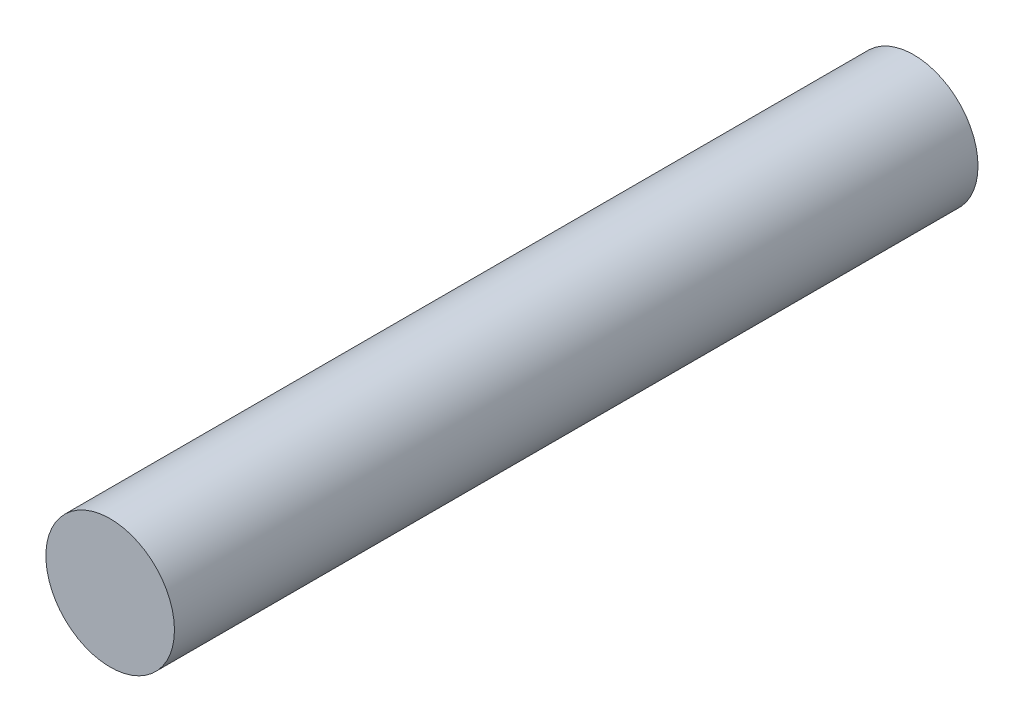
ISO-10303-21;
HEADER;
FILE_DESCRIPTION(('STEP AP214'),'2;1');
FILE_NAME('part.step','',(''),(''),'','','');
FILE_SCHEMA(('AUTOMOTIVE_DESIGN { 1 0 10303 214 1 1 1 1 }'));
ENDSEC;
DATA;
#1=APPLICATION_CONTEXT('core data for automotive mechanical design processes');
#2=APPLICATION_PROTOCOL_DEFINITION('international standard','automotive_design',2000,#1);
#3=PRODUCT_CONTEXT('',#1,'mechanical');
#4=PRODUCT('Part','Part','',(#3));
#5=PRODUCT_RELATED_PRODUCT_CATEGORY('part','',(#4));
#6=PRODUCT_DEFINITION_FORMATION('','',#4);
#7=PRODUCT_DEFINITION_CONTEXT('part definition',#1,'design');
#8=PRODUCT_DEFINITION('design','',#6,#7);
#9=PRODUCT_DEFINITION_SHAPE('','',#8);
#10=(LENGTH_UNIT() NAMED_UNIT(*) SI_UNIT(.MILLI.,.METRE.));
#11=(NAMED_UNIT(*) PLANE_ANGLE_UNIT() SI_UNIT($,.RADIAN.));
#12=(NAMED_UNIT(*) SI_UNIT($,.STERADIAN.) SOLID_ANGLE_UNIT());
#13=UNCERTAINTY_MEASURE_WITH_UNIT(LENGTH_MEASURE(1.E-05),#10,'distance_accuracy_value','');
#14=(GEOMETRIC_REPRESENTATION_CONTEXT(3) GLOBAL_UNCERTAINTY_ASSIGNED_CONTEXT((#13)) GLOBAL_UNIT_ASSIGNED_CONTEXT((#10,
#11,#12)) REPRESENTATION_CONTEXT('',''));
#15=CARTESIAN_POINT('',(0.,0.,0.));
#16=DIRECTION('',(0.,0.,1.));
#17=DIRECTION('',(1.,0.,0.));
#18=AXIS2_PLACEMENT_3D('',#15,#16,#17);
#19=CARTESIAN_POINT('',(0.,0.,50.));
#20=DIRECTION('',(0.,0.,-1.));
#21=DIRECTION('',(-1.,0.,0.));
#22=AXIS2_PLACEMENT_3D('',#19,#20,#21);
#23=CYLINDRICAL_SURFACE('',#22,4.);
#24=CARTESIAN_POINT('',(0.,0.,50.));
#25=DIRECTION('',(0.,0.,1.));
#26=DIRECTION('',(1.,0.,0.));
#27=AXIS2_PLACEMENT_3D('',#24,#25,#26);
#28=CIRCLE('',#27,4.);
#29=CARTESIAN_POINT('',(4.,0.,50.));
#30=VERTEX_POINT('',#29);
#31=EDGE_CURVE('E11',#30,#30,#28,.T.);
#32=ORIENTED_EDGE('',*,*,#31,.F.);
#33=EDGE_LOOP('',(#32));
#34=FACE_BOUND('',#33,.T.);
#35=CARTESIAN_POINT('',(0.,0.,0.));
#36=DIRECTION('',(0.,0.,1.));
#37=DIRECTION('',(1.,0.,0.));
#38=AXIS2_PLACEMENT_3D('',#35,#36,#37);
#39=CIRCLE('',#38,4.);
#40=CARTESIAN_POINT('',(4.,0.,0.));
#41=VERTEX_POINT('',#40);
#42=EDGE_CURVE('E48',#41,#41,#39,.T.);
#43=ORIENTED_EDGE('',*,*,#42,.T.);
#44=EDGE_LOOP('',(#43));
#45=FACE_BOUND('',#44,.T.);
#46=ADVANCED_FACE('F45',(#34,#45),#23,.T.);
#47=CARTESIAN_POINT('',(0.,0.,50.));
#48=DIRECTION('',(0.,0.,1.));
#49=DIRECTION('',(1.,0.,0.));
#50=AXIS2_PLACEMENT_3D('',#47,#48,#49);
#51=PLANE('',#50);
#52=ORIENTED_EDGE('',*,*,#31,.T.);
#53=EDGE_LOOP('',(#52));
#54=FACE_BOUND('',#53,.T.);
#55=ADVANCED_FACE('F62',(#54),#51,.T.);
#56=CARTESIAN_POINT('',(0.,0.,0.));
#57=DIRECTION('',(0.,0.,1.));
#58=DIRECTION('',(1.,0.,0.));
#59=AXIS2_PLACEMENT_3D('',#56,#57,#58);
#60=PLANE('',#59);
#61=ORIENTED_EDGE('',*,*,#42,.F.);
#62=EDGE_LOOP('',(#61));
#63=FACE_BOUND('',#62,.T.);
#64=ADVANCED_FACE('F60',(#63),#60,.F.);
#65=CLOSED_SHELL('',(#46,#55,#64));
#66=MANIFOLD_SOLID_BREP('B2',#65);
#67=CARTESIAN_POINT('',(0.,0.,15.));
#68=DIRECTION('',(0.,0.,-1.));
#69=DIRECTION('',(-1.,0.,0.));
#70=AXIS2_PLACEMENT_3D('',#67,#68,#69);
#71=CYLINDRICAL_SURFACE('',#70,4.);
#72=CARTESIAN_POINT('',(0.,0.,15.));
#73=DIRECTION('',(0.,0.,1.));
#74=DIRECTION('',(1.,0.,0.));
#75=AXIS2_PLACEMENT_3D('',#72,#73,#74);
#76=CIRCLE('',#75,4.);
#77=CARTESIAN_POINT('',(4.,0.,15.));
#78=VERTEX_POINT('',#77);
#79=EDGE_CURVE('E44',#78,#78,#76,.T.);
#80=ORIENTED_EDGE('',*,*,#79,.F.);
#81=EDGE_LOOP('',(#80));
#82=FACE_BOUND('',#81,.T.);
#83=CARTESIAN_POINT('',(0.,0.,0.));
#84=DIRECTION('',(0.,0.,1.));
#85=DIRECTION('',(1.,0.,0.));
#86=AXIS2_PLACEMENT_3D('',#83,#84,#85);
#87=CIRCLE('',#86,4.);
#88=CARTESIAN_POINT('',(4.,0.,0.));
#89=VERTEX_POINT('',#88);
#90=EDGE_CURVE('E91',#89,#89,#87,.T.);
#91=ORIENTED_EDGE('',*,*,#90,.T.);
#92=EDGE_LOOP('',(#91));
#93=FACE_BOUND('',#92,.T.);
#94=ADVANCED_FACE('F88',(#82,#93),#71,.T.);
#95=CARTESIAN_POINT('',(0.,0.,15.));
#96=DIRECTION('',(0.,0.,1.));
#97=DIRECTION('',(1.,0.,0.));
#98=AXIS2_PLACEMENT_3D('',#95,#96,#97);
#99=PLANE('',#98);
#100=ORIENTED_EDGE('',*,*,#79,.T.);
#101=EDGE_LOOP('',(#100));
#102=FACE_BOUND('',#101,.T.);
#103=ADVANCED_FACE('F103',(#102),#99,.T.);
#104=CARTESIAN_POINT('',(0.,0.,0.));
#105=DIRECTION('',(0.,0.,1.));
#106=DIRECTION('',(1.,0.,0.));
#107=AXIS2_PLACEMENT_3D('',#104,#105,#106);
#108=PLANE('',#107);
#109=ORIENTED_EDGE('',*,*,#90,.F.);
#110=EDGE_LOOP('',(#109));
#111=FACE_BOUND('',#110,.T.);
#112=ADVANCED_FACE('F101',(#111),#108,.F.);
#113=CLOSED_SHELL('',(#94,#103,#112));
#114=MANIFOLD_SOLID_BREP('B6',#113);
#115=ADVANCED_BREP_SHAPE_REPRESENTATION('',(#18,#66,#114),#14);
#116=SHAPE_DEFINITION_REPRESENTATION(#9,#115);
ENDSEC;
END-ISO-10303-21;
